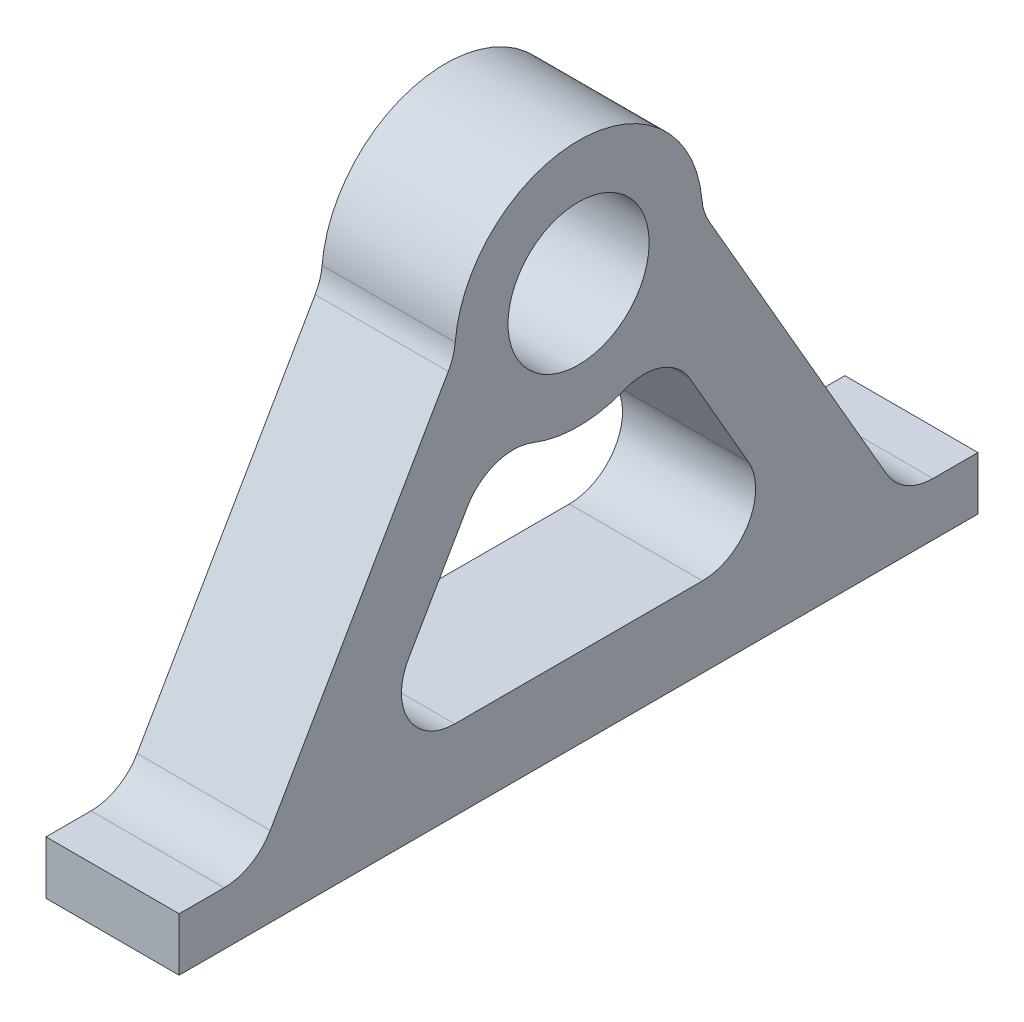
ISO-10303-21;
HEADER;
FILE_DESCRIPTION(('STEP AP214'),'2;1');
FILE_NAME('part.step','',(''),(''),'','','');
FILE_SCHEMA(('AUTOMOTIVE_DESIGN { 1 0 10303 214 1 1 1 1 }'));
ENDSEC;
DATA;
#1=APPLICATION_CONTEXT('core data for automotive mechanical design processes');
#2=APPLICATION_PROTOCOL_DEFINITION('international standard','automotive_design',2000,#1);
#3=PRODUCT_CONTEXT('',#1,'mechanical');
#4=PRODUCT('Part','Part','',(#3));
#5=PRODUCT_RELATED_PRODUCT_CATEGORY('part','',(#4));
#6=PRODUCT_DEFINITION_FORMATION('','',#4);
#7=PRODUCT_DEFINITION_CONTEXT('part definition',#1,'design');
#8=PRODUCT_DEFINITION('design','',#6,#7);
#9=PRODUCT_DEFINITION_SHAPE('','',#8);
#10=(LENGTH_UNIT() NAMED_UNIT(*) SI_UNIT(.MILLI.,.METRE.));
#11=(NAMED_UNIT(*) PLANE_ANGLE_UNIT() SI_UNIT($,.RADIAN.));
#12=(NAMED_UNIT(*) SI_UNIT($,.STERADIAN.) SOLID_ANGLE_UNIT());
#13=UNCERTAINTY_MEASURE_WITH_UNIT(LENGTH_MEASURE(1.E-05),#10,'distance_accuracy_value','');
#14=(GEOMETRIC_REPRESENTATION_CONTEXT(3) GLOBAL_UNCERTAINTY_ASSIGNED_CONTEXT((#13)) GLOBAL_UNIT_ASSIGNED_CONTEXT((#10,
#11,#12)) REPRESENTATION_CONTEXT('',''));
#15=CARTESIAN_POINT('',(0.,0.,0.));
#16=DIRECTION('',(0.,0.,1.));
#17=DIRECTION('',(1.,0.,0.));
#18=AXIS2_PLACEMENT_3D('',#15,#16,#17);
#19=CARTESIAN_POINT('',(2.5,0.,0.));
#20=DIRECTION('',(1.,0.,0.));
#21=DIRECTION('',(0.,0.,-1.));
#22=AXIS2_PLACEMENT_3D('',#19,#20,#21);
#23=PLANE('',#22);
#24=DIRECTION('',(0.,0.866025403784442,0.499999999999995));
#25=VECTOR('',#24,1.);
#26=CARTESIAN_POINT('',(2.5,0.,-4.65));
#27=LINE('',#26,#25);
#28=CARTESIAN_POINT('',(2.5,-12.,-11.5782032302754));
#29=VERTEX_POINT('',#28);
#30=CARTESIAN_POINT('',(2.5,-0.420246134902778,-4.89262921911202));
#31=VERTEX_POINT('',#30);
#32=EDGE_CURVE('E219',#29,#31,#27,.T.);
#33=ORIENTED_EDGE('',*,*,#32,.T.);
#34=CARTESIAN_POINT('',(2.5,0.579753865097213,-6.6246800266809));
#35=DIRECTION('',(1.,0.,0.));
#36=DIRECTION('',(0.,0.,-1.));
#37=AXIS2_PLACEMENT_3D('',#34,#35,#36);
#38=CIRCLE('',#37,2.);
#39=CARTESIAN_POINT('',(2.5,0.405391800406322,-4.63229505625055));
#40=VERTEX_POINT('',#39);
#41=EDGE_CURVE('E62',#31,#40,#38,.F.);
#42=ORIENTED_EDGE('',*,*,#41,.T.);
#43=CARTESIAN_POINT('',(2.5,0.,0.));
#44=DIRECTION('',(1.,0.,0.));
#45=DIRECTION('',(0.,0.,-1.));
#46=AXIS2_PLACEMENT_3D('',#43,#44,#45);
#47=CIRCLE('',#46,4.65);
#48=CARTESIAN_POINT('',(2.5,0.405391800406322,4.63229505625055));
#49=VERTEX_POINT('',#48);
#50=EDGE_CURVE('E250',#40,#49,#47,.T.);
#51=ORIENTED_EDGE('',*,*,#50,.T.);
#52=CARTESIAN_POINT('',(2.5,0.579753865097213,6.6246800266809));
#53=DIRECTION('',(1.,0.,0.));
#54=DIRECTION('',(0.,0.,-1.));
#55=AXIS2_PLACEMENT_3D('',#52,#53,#54);
#56=CIRCLE('',#55,2.);
#57=CARTESIAN_POINT('',(2.5,-0.420246134902778,4.89262921911202));
#58=VERTEX_POINT('',#57);
#59=EDGE_CURVE('E11',#49,#58,#56,.F.);
#60=ORIENTED_EDGE('',*,*,#59,.T.);
#61=DIRECTION('',(0.,-0.866025403784442,0.499999999999995));
#62=VECTOR('',#61,1.);
#63=CARTESIAN_POINT('',(2.5,0.,4.65));
#64=LINE('',#63,#62);
#65=CARTESIAN_POINT('',(2.5,-12.,11.5782032302754));
#66=VERTEX_POINT('',#65);
#67=EDGE_CURVE('E189',#58,#66,#64,.T.);
#68=ORIENTED_EDGE('',*,*,#67,.T.);
#69=CARTESIAN_POINT('',(2.5,-11.,13.3102540378443));
#70=DIRECTION('',(1.,0.,0.));
#71=DIRECTION('',(0.,0.,-1.));
#72=AXIS2_PLACEMENT_3D('',#69,#70,#71);
#73=CIRCLE('',#72,2.);
#74=CARTESIAN_POINT('',(2.5,-13.,13.3102540378443));
#75=VERTEX_POINT('',#74);
#76=EDGE_CURVE('E184',#66,#75,#73,.F.);
#77=ORIENTED_EDGE('',*,*,#76,.T.);
#78=DIRECTION('',(0.,0.,1.));
#79=VECTOR('',#78,1.);
#80=CARTESIAN_POINT('',(2.5,-13.,12.155553499465));
#81=LINE('',#80,#79);
#82=CARTESIAN_POINT('',(2.5,-13.,15.));
#83=VERTEX_POINT('',#82);
#84=EDGE_CURVE('E176',#75,#83,#81,.T.);
#85=ORIENTED_EDGE('',*,*,#84,.T.);
#86=DIRECTION('',(0.,-1.,0.));
#87=VECTOR('',#86,1.);
#88=CARTESIAN_POINT('',(2.5,-13.,15.));
#89=LINE('',#88,#87);
#90=CARTESIAN_POINT('',(2.5,-15.,15.));
#91=VERTEX_POINT('',#90);
#92=EDGE_CURVE('E180',#83,#91,#89,.T.);
#93=ORIENTED_EDGE('',*,*,#92,.T.);
#94=DIRECTION('',(0.,0.,-1.));
#95=VECTOR('',#94,1.);
#96=CARTESIAN_POINT('',(2.5,-15.,15.));
#97=LINE('',#96,#95);
#98=CARTESIAN_POINT('',(2.5,-15.,-15.));
#99=VERTEX_POINT('',#98);
#100=EDGE_CURVE('E206',#91,#99,#97,.T.);
#101=ORIENTED_EDGE('',*,*,#100,.T.);
#102=DIRECTION('',(0.,1.,0.));
#103=VECTOR('',#102,1.);
#104=CARTESIAN_POINT('',(2.5,-13.,-15.));
#105=LINE('',#104,#103);
#106=CARTESIAN_POINT('',(2.5,-13.,-15.));
#107=VERTEX_POINT('',#106);
#108=EDGE_CURVE('E209',#99,#107,#105,.T.);
#109=ORIENTED_EDGE('',*,*,#108,.T.);
#110=DIRECTION('',(0.,0.,1.));
#111=VECTOR('',#110,1.);
#112=CARTESIAN_POINT('',(2.5,-13.,-12.155553499465));
#113=LINE('',#112,#111);
#114=CARTESIAN_POINT('',(2.5,-13.,-13.3102540378443));
#115=VERTEX_POINT('',#114);
#116=EDGE_CURVE('E215',#107,#115,#113,.T.);
#117=ORIENTED_EDGE('',*,*,#116,.T.);
#118=CARTESIAN_POINT('',(2.5,-11.,-13.3102540378443));
#119=DIRECTION('',(1.,0.,0.));
#120=DIRECTION('',(0.,0.,-1.));
#121=AXIS2_PLACEMENT_3D('',#118,#119,#120);
#122=CIRCLE('',#121,2.);
#123=EDGE_CURVE('E316',#115,#29,#122,.F.);
#124=ORIENTED_EDGE('',*,*,#123,.T.);
#125=EDGE_LOOP('',(#33,#42,#51,#60,#68,#77,#85,#93,#101,#109,#117,#124));
#126=FACE_BOUND('',#125,.T.);
#127=CARTESIAN_POINT('',(2.5,0.,0.));
#128=DIRECTION('',(1.,0.,0.));
#129=DIRECTION('',(0.,0.,-1.));
#130=AXIS2_PLACEMENT_3D('',#127,#128,#129);
#131=CIRCLE('',#130,2.65);
#132=CARTESIAN_POINT('',(2.5,0.,-2.65));
#133=VERTEX_POINT('',#132);
#134=EDGE_CURVE('E227',#133,#133,#131,.T.);
#135=ORIENTED_EDGE('',*,*,#134,.F.);
#136=EDGE_LOOP('',(#135));
#137=FACE_BOUND('',#136,.T.);
#138=DIRECTION('',(0.,0.,-1.));
#139=VECTOR('',#138,1.);
#140=CARTESIAN_POINT('',(2.5,-12.,8.11410161513767));
#141=LINE('',#140,#139);
#142=CARTESIAN_POINT('',(2.5,-12.,4.64999999999994));
#143=VERTEX_POINT('',#142);
#144=CARTESIAN_POINT('',(2.5,-12.,-4.64999999999994));
#145=VERTEX_POINT('',#144);
#146=EDGE_CURVE('E403',#143,#145,#141,.T.);
#147=ORIENTED_EDGE('',*,*,#146,.F.);
#148=CARTESIAN_POINT('',(2.5,-10.,4.64999999999994));
#149=DIRECTION('',(1.,0.,0.));
#150=DIRECTION('',(0.,0.,-1.));
#151=AXIS2_PLACEMENT_3D('',#148,#149,#150);
#152=CIRCLE('',#151,2.);
#153=CARTESIAN_POINT('',(2.5,-9.00000000000001,6.38205080756882));
#154=VERTEX_POINT('',#153);
#155=EDGE_CURVE('E333',#143,#154,#152,.F.);
#156=ORIENTED_EDGE('',*,*,#155,.T.);
#157=DIRECTION('',(0.,-0.866025403784442,0.499999999999995));
#158=VECTOR('',#157,1.);
#159=CARTESIAN_POINT('',(2.5,-3.41406020028672,3.15700696052736));
#160=LINE('',#159,#158);
#161=CARTESIAN_POINT('',(2.5,-5.1835827124483,4.17864125926093));
#162=VERTEX_POINT('',#161);
#163=EDGE_CURVE('E383',#162,#154,#160,.T.);
#164=ORIENTED_EDGE('',*,*,#163,.F.);
#165=CARTESIAN_POINT('',(2.5,-6.18358271244829,2.44659045169205));
#166=DIRECTION('',(1.,0.,0.));
#167=DIRECTION('',(0.,0.,-1.));
#168=AXIS2_PLACEMENT_3D('',#165,#166,#167);
#169=CIRCLE('',#168,2.);
#170=CARTESIAN_POINT('',(2.5,-4.32385858840369,1.71077377449143));
#171=VERTEX_POINT('',#170);
#172=EDGE_CURVE('E339',#162,#171,#169,.F.);
#173=ORIENTED_EDGE('',*,*,#172,.T.);
#174=CARTESIAN_POINT('',(2.5,0.,0.));
#175=DIRECTION('',(-1.,0.,0.));
#176=DIRECTION('',(0.,0.,-1.));
#177=AXIS2_PLACEMENT_3D('',#174,#175,#176);
#178=CIRCLE('',#177,4.65);
#179=CARTESIAN_POINT('',(2.5,-4.32385858840369,-1.71077377449143));
#180=VERTEX_POINT('',#179);
#181=EDGE_CURVE('E375',#180,#171,#178,.T.);
#182=ORIENTED_EDGE('',*,*,#181,.F.);
#183=CARTESIAN_POINT('',(2.5,-6.18358271244829,-2.44659045169205));
#184=DIRECTION('',(1.,0.,0.));
#185=DIRECTION('',(0.,0.,-1.));
#186=AXIS2_PLACEMENT_3D('',#183,#184,#185);
#187=CIRCLE('',#186,2.);
#188=CARTESIAN_POINT('',(2.5,-5.1835827124483,-4.17864125926093));
#189=VERTEX_POINT('',#188);
#190=EDGE_CURVE('E345',#180,#189,#187,.F.);
#191=ORIENTED_EDGE('',*,*,#190,.T.);
#192=DIRECTION('',(0.,0.866025403784442,0.499999999999995));
#193=VECTOR('',#192,1.);
#194=CARTESIAN_POINT('',(2.5,-3.41406020028672,-3.15700696052736));
#195=LINE('',#194,#193);
#196=CARTESIAN_POINT('',(2.5,-9.00000000000001,-6.38205080756882));
#197=VERTEX_POINT('',#196);
#198=EDGE_CURVE('E399',#197,#189,#195,.T.);
#199=ORIENTED_EDGE('',*,*,#198,.F.);
#200=CARTESIAN_POINT('',(2.5,-10.,-4.64999999999994));
#201=DIRECTION('',(1.,0.,0.));
#202=DIRECTION('',(0.,0.,-1.));
#203=AXIS2_PLACEMENT_3D('',#200,#201,#202);
#204=CIRCLE('',#203,2.);
#205=EDGE_CURVE('E327',#197,#145,#204,.F.);
#206=ORIENTED_EDGE('',*,*,#205,.T.);
#207=EDGE_LOOP('',(#147,#156,#164,#173,#182,#191,#199,#206));
#208=FACE_BOUND('',#207,.T.);
#209=ADVANCED_FACE('F39',(#126,#137,#208),#23,.T.);
#210=CARTESIAN_POINT('',(-2.5,0.,0.));
#211=DIRECTION('',(1.,0.,0.));
#212=DIRECTION('',(0.,0.,-1.));
#213=AXIS2_PLACEMENT_3D('',#210,#211,#212);
#214=PLANE('',#213);
#215=CARTESIAN_POINT('',(-2.5,0.,0.));
#216=DIRECTION('',(1.,0.,0.));
#217=DIRECTION('',(0.,0.,-1.));
#218=AXIS2_PLACEMENT_3D('',#215,#216,#217);
#219=CIRCLE('',#218,2.65);
#220=CARTESIAN_POINT('',(-2.5,0.,-2.65));
#221=VERTEX_POINT('',#220);
#222=EDGE_CURVE('E371',#221,#221,#219,.T.);
#223=ORIENTED_EDGE('',*,*,#222,.T.);
#224=EDGE_LOOP('',(#223));
#225=FACE_BOUND('',#224,.T.);
#226=CARTESIAN_POINT('',(-2.5,0.,0.));
#227=DIRECTION('',(1.,0.,0.));
#228=DIRECTION('',(0.,0.,-1.));
#229=AXIS2_PLACEMENT_3D('',#226,#227,#228);
#230=CIRCLE('',#229,4.65);
#231=CARTESIAN_POINT('',(-2.5,0.405391800406322,-4.63229505625055));
#232=VERTEX_POINT('',#231);
#233=CARTESIAN_POINT('',(-2.5,0.405391800406322,4.63229505625055));
#234=VERTEX_POINT('',#233);
#235=EDGE_CURVE('E223',#232,#234,#230,.T.);
#236=ORIENTED_EDGE('',*,*,#235,.F.);
#237=CARTESIAN_POINT('',(-2.5,0.579753865097213,-6.6246800266809));
#238=DIRECTION('',(1.,0.,0.));
#239=DIRECTION('',(0.,0.,-1.));
#240=AXIS2_PLACEMENT_3D('',#237,#238,#239);
#241=CIRCLE('',#240,2.);
#242=CARTESIAN_POINT('',(-2.5,-0.420246134902778,-4.89262921911202));
#243=VERTEX_POINT('',#242);
#244=EDGE_CURVE('E348',#232,#243,#241,.T.);
#245=ORIENTED_EDGE('',*,*,#244,.T.);
#246=DIRECTION('',(0.,0.866025403784442,0.499999999999995));
#247=VECTOR('',#246,1.);
#248=CARTESIAN_POINT('',(-2.5,0.,-4.65));
#249=LINE('',#248,#247);
#250=CARTESIAN_POINT('',(-2.5,-12.,-11.5782032302754));
#251=VERTEX_POINT('',#250);
#252=EDGE_CURVE('E246',#251,#243,#249,.T.);
#253=ORIENTED_EDGE('',*,*,#252,.F.);
#254=CARTESIAN_POINT('',(-2.5,-11.,-13.3102540378443));
#255=DIRECTION('',(1.,0.,0.));
#256=DIRECTION('',(0.,0.,-1.));
#257=AXIS2_PLACEMENT_3D('',#254,#255,#256);
#258=CIRCLE('',#257,2.);
#259=CARTESIAN_POINT('',(-2.5,-13.,-13.3102540378443));
#260=VERTEX_POINT('',#259);
#261=EDGE_CURVE('E313',#251,#260,#258,.T.);
#262=ORIENTED_EDGE('',*,*,#261,.T.);
#263=DIRECTION('',(0.,0.,1.));
#264=VECTOR('',#263,1.);
#265=CARTESIAN_POINT('',(-2.5,-13.,-12.155553499465));
#266=LINE('',#265,#264);
#267=CARTESIAN_POINT('',(-2.5,-13.,-15.));
#268=VERTEX_POINT('',#267);
#269=EDGE_CURVE('E242',#268,#260,#266,.T.);
#270=ORIENTED_EDGE('',*,*,#269,.F.);
#271=DIRECTION('',(0.,1.,0.));
#272=VECTOR('',#271,1.);
#273=CARTESIAN_POINT('',(-2.5,-13.,-15.));
#274=LINE('',#273,#272);
#275=CARTESIAN_POINT('',(-2.5,-15.,-15.));
#276=VERTEX_POINT('',#275);
#277=EDGE_CURVE('E239',#276,#268,#274,.T.);
#278=ORIENTED_EDGE('',*,*,#277,.F.);
#279=DIRECTION('',(0.,0.,-1.));
#280=VECTOR('',#279,1.);
#281=CARTESIAN_POINT('',(-2.5,-15.,15.));
#282=LINE('',#281,#280);
#283=CARTESIAN_POINT('',(-2.5,-15.,15.));
#284=VERTEX_POINT('',#283);
#285=EDGE_CURVE('E236',#284,#276,#282,.T.);
#286=ORIENTED_EDGE('',*,*,#285,.F.);
#287=DIRECTION('',(0.,-1.,0.));
#288=VECTOR('',#287,1.);
#289=CARTESIAN_POINT('',(-2.5,-13.,15.));
#290=LINE('',#289,#288);
#291=CARTESIAN_POINT('',(-2.5,-13.,15.));
#292=VERTEX_POINT('',#291);
#293=EDGE_CURVE('E233',#292,#284,#290,.T.);
#294=ORIENTED_EDGE('',*,*,#293,.F.);
#295=DIRECTION('',(0.,0.,1.));
#296=VECTOR('',#295,1.);
#297=CARTESIAN_POINT('',(-2.5,-13.,12.155553499465));
#298=LINE('',#297,#296);
#299=CARTESIAN_POINT('',(-2.5,-13.,13.3102540378443));
#300=VERTEX_POINT('',#299);
#301=EDGE_CURVE('E195',#300,#292,#298,.T.);
#302=ORIENTED_EDGE('',*,*,#301,.F.);
#303=CARTESIAN_POINT('',(-2.5,-11.,13.3102540378443));
#304=DIRECTION('',(1.,0.,0.));
#305=DIRECTION('',(0.,0.,-1.));
#306=AXIS2_PLACEMENT_3D('',#303,#304,#305);
#307=CIRCLE('',#306,2.);
#308=CARTESIAN_POINT('',(-2.5,-12.,11.5782032302754));
#309=VERTEX_POINT('',#308);
#310=EDGE_CURVE('E319',#300,#309,#307,.T.);
#311=ORIENTED_EDGE('',*,*,#310,.T.);
#312=DIRECTION('',(0.,-0.866025403784442,0.499999999999995));
#313=VECTOR('',#312,1.);
#314=CARTESIAN_POINT('',(-2.5,0.,4.65));
#315=LINE('',#314,#313);
#316=CARTESIAN_POINT('',(-2.5,-0.420246134902778,4.89262921911202));
#317=VERTEX_POINT('',#316);
#318=EDGE_CURVE('E226',#317,#309,#315,.T.);
#319=ORIENTED_EDGE('',*,*,#318,.F.);
#320=CARTESIAN_POINT('',(-2.5,0.579753865097213,6.6246800266809));
#321=DIRECTION('',(1.,0.,0.));
#322=DIRECTION('',(0.,0.,-1.));
#323=AXIS2_PLACEMENT_3D('',#320,#321,#322);
#324=CIRCLE('',#323,2.);
#325=EDGE_CURVE('E48',#317,#234,#324,.T.);
#326=ORIENTED_EDGE('',*,*,#325,.T.);
#327=EDGE_LOOP('',(#236,#245,#253,#262,#270,#278,#286,#294,#302,#311,#319,#326));
#328=FACE_BOUND('',#327,.T.);
#329=CARTESIAN_POINT('',(-2.5,0.,0.));
#330=DIRECTION('',(-1.,0.,0.));
#331=DIRECTION('',(0.,0.,-1.));
#332=AXIS2_PLACEMENT_3D('',#329,#330,#331);
#333=CIRCLE('',#332,4.65);
#334=CARTESIAN_POINT('',(-2.5,-4.32385858840369,-1.71077377449143));
#335=VERTEX_POINT('',#334);
#336=CARTESIAN_POINT('',(-2.5,-4.32385858840369,1.71077377449143));
#337=VERTEX_POINT('',#336);
#338=EDGE_CURVE('E379',#335,#337,#333,.T.);
#339=ORIENTED_EDGE('',*,*,#338,.T.);
#340=CARTESIAN_POINT('',(-2.5,-6.18358271244829,2.44659045169205));
#341=DIRECTION('',(1.,0.,0.));
#342=DIRECTION('',(0.,0.,-1.));
#343=AXIS2_PLACEMENT_3D('',#340,#341,#342);
#344=CIRCLE('',#343,2.);
#345=CARTESIAN_POINT('',(-2.5,-5.1835827124483,4.17864125926093));
#346=VERTEX_POINT('',#345);
#347=EDGE_CURVE('E336',#337,#346,#344,.T.);
#348=ORIENTED_EDGE('',*,*,#347,.T.);
#349=DIRECTION('',(0.,-0.866025403784442,0.499999999999995));
#350=VECTOR('',#349,1.);
#351=CARTESIAN_POINT('',(-2.5,-3.41406020028672,3.15700696052736));
#352=LINE('',#351,#350);
#353=CARTESIAN_POINT('',(-2.5,-9.00000000000001,6.38205080756882));
#354=VERTEX_POINT('',#353);
#355=EDGE_CURVE('E392',#346,#354,#352,.T.);
#356=ORIENTED_EDGE('',*,*,#355,.T.);
#357=CARTESIAN_POINT('',(-2.5,-10.,4.64999999999994));
#358=DIRECTION('',(1.,0.,0.));
#359=DIRECTION('',(0.,0.,-1.));
#360=AXIS2_PLACEMENT_3D('',#357,#358,#359);
#361=CIRCLE('',#360,2.);
#362=CARTESIAN_POINT('',(-2.5,-12.,4.64999999999994));
#363=VERTEX_POINT('',#362);
#364=EDGE_CURVE('E330',#354,#363,#361,.T.);
#365=ORIENTED_EDGE('',*,*,#364,.T.);
#366=DIRECTION('',(0.,0.,-1.));
#367=VECTOR('',#366,1.);
#368=CARTESIAN_POINT('',(-2.5,-12.,8.11410161513767));
#369=LINE('',#368,#367);
#370=CARTESIAN_POINT('',(-2.5,-12.,-4.64999999999994));
#371=VERTEX_POINT('',#370);
#372=EDGE_CURVE('E388',#363,#371,#369,.T.);
#373=ORIENTED_EDGE('',*,*,#372,.T.);
#374=CARTESIAN_POINT('',(-2.5,-10.,-4.64999999999994));
#375=DIRECTION('',(1.,0.,0.));
#376=DIRECTION('',(0.,0.,-1.));
#377=AXIS2_PLACEMENT_3D('',#374,#375,#376);
#378=CIRCLE('',#377,2.);
#379=CARTESIAN_POINT('',(-2.5,-9.00000000000001,-6.38205080756882));
#380=VERTEX_POINT('',#379);
#381=EDGE_CURVE('E324',#371,#380,#378,.T.);
#382=ORIENTED_EDGE('',*,*,#381,.T.);
#383=DIRECTION('',(0.,0.866025403784442,0.499999999999995));
#384=VECTOR('',#383,1.);
#385=CARTESIAN_POINT('',(-2.5,-3.41406020028672,-3.15700696052736));
#386=LINE('',#385,#384);
#387=CARTESIAN_POINT('',(-2.5,-5.1835827124483,-4.17864125926093));
#388=VERTEX_POINT('',#387);
#389=EDGE_CURVE('E384',#380,#388,#386,.T.);
#390=ORIENTED_EDGE('',*,*,#389,.T.);
#391=CARTESIAN_POINT('',(-2.5,-6.18358271244829,-2.44659045169205));
#392=DIRECTION('',(1.,0.,0.));
#393=DIRECTION('',(0.,0.,-1.));
#394=AXIS2_PLACEMENT_3D('',#391,#392,#393);
#395=CIRCLE('',#394,2.);
#396=EDGE_CURVE('E342',#388,#335,#395,.T.);
#397=ORIENTED_EDGE('',*,*,#396,.T.);
#398=EDGE_LOOP('',(#339,#348,#356,#365,#373,#382,#390,#397));
#399=FACE_BOUND('',#398,.T.);
#400=ADVANCED_FACE('F356',(#225,#328,#399),#214,.F.);
#401=CARTESIAN_POINT('',(2.5,0.,0.));
#402=DIRECTION('',(-1.,0.,0.));
#403=DIRECTION('',(0.,0.,1.));
#404=AXIS2_PLACEMENT_3D('',#401,#402,#403);
#405=CYLINDRICAL_SURFACE('',#404,4.65);
#406=ORIENTED_EDGE('',*,*,#50,.F.);
#407=DIRECTION('',(-1.,0.,0.));
#408=VECTOR('',#407,1.);
#409=CARTESIAN_POINT('',(2.5,0.405391800406322,-4.63229505625055));
#410=LINE('',#409,#408);
#411=EDGE_CURVE('E309',#40,#232,#410,.T.);
#412=ORIENTED_EDGE('',*,*,#411,.T.);
#413=ORIENTED_EDGE('',*,*,#235,.T.);
#414=DIRECTION('',(-1.,0.,0.));
#415=VECTOR('',#414,1.);
#416=CARTESIAN_POINT('',(2.5,0.405391800406322,4.63229505625055));
#417=LINE('',#416,#415);
#418=EDGE_CURVE('E55',#234,#49,#417,.F.);
#419=ORIENTED_EDGE('',*,*,#418,.T.);
#420=EDGE_LOOP('',(#406,#412,#413,#419));
#421=FACE_BOUND('',#420,.T.);
#422=ADVANCED_FACE('F360',(#421),#405,.T.);
#423=CARTESIAN_POINT('',(2.5,0.,4.65));
#424=DIRECTION('',(0.,-0.499999999999995,-0.866025403784442));
#425=DIRECTION('',(0.,0.866025403784442,-0.499999999999995));
#426=AXIS2_PLACEMENT_3D('',#423,#424,#425);
#427=PLANE('',#426);
#428=ORIENTED_EDGE('',*,*,#318,.T.);
#429=DIRECTION('',(-1.,0.,0.));
#430=VECTOR('',#429,1.);
#431=CARTESIAN_POINT('',(2.5,-12.,11.5782032302754));
#432=LINE('',#431,#430);
#433=EDGE_CURVE('E276',#309,#66,#432,.F.);
#434=ORIENTED_EDGE('',*,*,#433,.T.);
#435=ORIENTED_EDGE('',*,*,#67,.F.);
#436=DIRECTION('',(1.,0.,0.));
#437=VECTOR('',#436,1.);
#438=CARTESIAN_POINT('',(-2.5,-0.420246134902778,4.89262921911202));
#439=LINE('',#438,#437);
#440=EDGE_CURVE('E272',#58,#317,#439,.F.);
#441=ORIENTED_EDGE('',*,*,#440,.T.);
#442=EDGE_LOOP('',(#428,#434,#435,#441));
#443=FACE_BOUND('',#442,.T.);
#444=ADVANCED_FACE('F365',(#443),#427,.F.);
#445=CARTESIAN_POINT('',(2.5,-13.,12.155553499465));
#446=DIRECTION('',(0.,-1.,0.));
#447=DIRECTION('',(0.,0.,-1.));
#448=AXIS2_PLACEMENT_3D('',#445,#446,#447);
#449=PLANE('',#448);
#450=ORIENTED_EDGE('',*,*,#84,.F.);
#451=DIRECTION('',(-1.,0.,0.));
#452=VECTOR('',#451,1.);
#453=CARTESIAN_POINT('',(-2.5,-13.,13.3102540378443));
#454=LINE('',#453,#452);
#455=EDGE_CURVE('E269',#75,#300,#454,.T.);
#456=ORIENTED_EDGE('',*,*,#455,.T.);
#457=ORIENTED_EDGE('',*,*,#301,.T.);
#458=DIRECTION('',(-1.,0.,0.));
#459=VECTOR('',#458,1.);
#460=CARTESIAN_POINT('',(2.5,-13.,15.));
#461=LINE('',#460,#459);
#462=EDGE_CURVE('E192',#83,#292,#461,.T.);
#463=ORIENTED_EDGE('',*,*,#462,.F.);
#464=EDGE_LOOP('',(#450,#456,#457,#463));
#465=FACE_BOUND('',#464,.T.);
#466=ADVANCED_FACE('F193',(#465),#449,.F.);
#467=CARTESIAN_POINT('',(2.5,-13.,15.));
#468=DIRECTION('',(0.,0.,-1.));
#469=DIRECTION('',(-1.,0.,0.));
#470=AXIS2_PLACEMENT_3D('',#467,#468,#469);
#471=PLANE('',#470);
#472=ORIENTED_EDGE('',*,*,#293,.T.);
#473=DIRECTION('',(-1.,0.,0.));
#474=VECTOR('',#473,1.);
#475=CARTESIAN_POINT('',(2.5,-15.,15.));
#476=LINE('',#475,#474);
#477=EDGE_CURVE('E200',#91,#284,#476,.T.);
#478=ORIENTED_EDGE('',*,*,#477,.F.);
#479=ORIENTED_EDGE('',*,*,#92,.F.);
#480=ORIENTED_EDGE('',*,*,#462,.T.);
#481=EDGE_LOOP('',(#472,#478,#479,#480));
#482=FACE_BOUND('',#481,.T.);
#483=ADVANCED_FACE('F202',(#482),#471,.F.);
#484=CARTESIAN_POINT('',(2.5,-15.,15.));
#485=DIRECTION('',(0.,1.,0.));
#486=DIRECTION('',(0.,0.,1.));
#487=AXIS2_PLACEMENT_3D('',#484,#485,#486);
#488=PLANE('',#487);
#489=ORIENTED_EDGE('',*,*,#285,.T.);
#490=DIRECTION('',(-1.,0.,0.));
#491=VECTOR('',#490,1.);
#492=CARTESIAN_POINT('',(2.5,-15.,-15.));
#493=LINE('',#492,#491);
#494=EDGE_CURVE('E254',#99,#276,#493,.T.);
#495=ORIENTED_EDGE('',*,*,#494,.F.);
#496=ORIENTED_EDGE('',*,*,#100,.F.);
#497=ORIENTED_EDGE('',*,*,#477,.T.);
#498=EDGE_LOOP('',(#489,#495,#496,#497));
#499=FACE_BOUND('',#498,.T.);
#500=ADVANCED_FACE('F468',(#499),#488,.F.);
#501=CARTESIAN_POINT('',(2.5,-13.,-15.));
#502=DIRECTION('',(0.,0.,1.));
#503=DIRECTION('',(1.,0.,0.));
#504=AXIS2_PLACEMENT_3D('',#501,#502,#503);
#505=PLANE('',#504);
#506=ORIENTED_EDGE('',*,*,#277,.T.);
#507=DIRECTION('',(-1.,0.,0.));
#508=VECTOR('',#507,1.);
#509=CARTESIAN_POINT('',(2.5,-13.,-15.));
#510=LINE('',#509,#508);
#511=EDGE_CURVE('E222',#107,#268,#510,.T.);
#512=ORIENTED_EDGE('',*,*,#511,.F.);
#513=ORIENTED_EDGE('',*,*,#108,.F.);
#514=ORIENTED_EDGE('',*,*,#494,.T.);
#515=EDGE_LOOP('',(#506,#512,#513,#514));
#516=FACE_BOUND('',#515,.T.);
#517=ADVANCED_FACE('F464',(#516),#505,.F.);
#518=CARTESIAN_POINT('',(2.5,-13.,-12.155553499465));
#519=DIRECTION('',(0.,-1.,0.));
#520=DIRECTION('',(0.,0.,-1.));
#521=AXIS2_PLACEMENT_3D('',#518,#519,#520);
#522=PLANE('',#521);
#523=ORIENTED_EDGE('',*,*,#269,.T.);
#524=DIRECTION('',(-1.,0.,0.));
#525=VECTOR('',#524,1.);
#526=CARTESIAN_POINT('',(2.5,-13.,-13.3102540378443));
#527=LINE('',#526,#525);
#528=EDGE_CURVE('E266',#260,#115,#527,.F.);
#529=ORIENTED_EDGE('',*,*,#528,.T.);
#530=ORIENTED_EDGE('',*,*,#116,.F.);
#531=ORIENTED_EDGE('',*,*,#511,.T.);
#532=EDGE_LOOP('',(#523,#529,#530,#531));
#533=FACE_BOUND('',#532,.T.);
#534=ADVANCED_FACE('F460',(#533),#522,.F.);
#535=CARTESIAN_POINT('',(2.5,0.,-4.65));
#536=DIRECTION('',(0.,-0.499999999999995,0.866025403784442));
#537=DIRECTION('',(0.,-0.866025403784442,-0.499999999999995));
#538=AXIS2_PLACEMENT_3D('',#535,#536,#537);
#539=PLANE('',#538);
#540=ORIENTED_EDGE('',*,*,#32,.F.);
#541=DIRECTION('',(-1.,0.,0.));
#542=VECTOR('',#541,1.);
#543=CARTESIAN_POINT('',(-2.5,-12.,-11.5782032302754));
#544=LINE('',#543,#542);
#545=EDGE_CURVE('E262',#29,#251,#544,.T.);
#546=ORIENTED_EDGE('',*,*,#545,.T.);
#547=ORIENTED_EDGE('',*,*,#252,.T.);
#548=DIRECTION('',(1.,0.,0.));
#549=VECTOR('',#548,1.);
#550=CARTESIAN_POINT('',(2.5,-0.420246134902778,-4.89262921911202));
#551=LINE('',#550,#549);
#552=EDGE_CURVE('E199',#243,#31,#551,.T.);
#553=ORIENTED_EDGE('',*,*,#552,.T.);
#554=EDGE_LOOP('',(#540,#546,#547,#553));
#555=FACE_BOUND('',#554,.T.);
#556=ADVANCED_FACE('F457',(#555),#539,.F.);
#557=CARTESIAN_POINT('',(2.5,0.,0.));
#558=DIRECTION('',(-1.,0.,0.));
#559=DIRECTION('',(0.,0.,1.));
#560=AXIS2_PLACEMENT_3D('',#557,#558,#559);
#561=CYLINDRICAL_SURFACE('',#560,2.65);
#562=ORIENTED_EDGE('',*,*,#134,.T.);
#563=EDGE_LOOP('',(#562));
#564=FACE_BOUND('',#563,.T.);
#565=ORIENTED_EDGE('',*,*,#222,.F.);
#566=EDGE_LOOP('',(#565));
#567=FACE_BOUND('',#566,.T.);
#568=ADVANCED_FACE('F454',(#564,#567),#561,.F.);
#569=CARTESIAN_POINT('',(2.5,-3.41406020028672,3.15700696052736));
#570=DIRECTION('',(0.,-0.499999999999995,-0.866025403784442));
#571=DIRECTION('',(0.,0.866025403784442,-0.499999999999995));
#572=AXIS2_PLACEMENT_3D('',#569,#570,#571);
#573=PLANE('',#572);
#574=ORIENTED_EDGE('',*,*,#163,.T.);
#575=DIRECTION('',(-1.,0.,0.));
#576=VECTOR('',#575,1.);
#577=CARTESIAN_POINT('',(-2.5,-9.00000000000001,6.38205080756882));
#578=LINE('',#577,#576);
#579=EDGE_CURVE('E296',#154,#354,#578,.T.);
#580=ORIENTED_EDGE('',*,*,#579,.T.);
#581=ORIENTED_EDGE('',*,*,#355,.F.);
#582=DIRECTION('',(1.,0.,0.));
#583=VECTOR('',#582,1.);
#584=CARTESIAN_POINT('',(2.5,-5.1835827124483,4.17864125926093));
#585=LINE('',#584,#583);
#586=EDGE_CURVE('E293',#346,#162,#585,.T.);
#587=ORIENTED_EDGE('',*,*,#586,.T.);
#588=EDGE_LOOP('',(#574,#580,#581,#587));
#589=FACE_BOUND('',#588,.T.);
#590=ADVANCED_FACE('F412',(#589),#573,.T.);
#591=CARTESIAN_POINT('',(2.5,-12.,8.11410161513767));
#592=DIRECTION('',(0.,1.,0.));
#593=DIRECTION('',(0.,0.,1.));
#594=AXIS2_PLACEMENT_3D('',#591,#592,#593);
#595=PLANE('',#594);
#596=ORIENTED_EDGE('',*,*,#146,.T.);
#597=DIRECTION('',(-1.,0.,0.));
#598=VECTOR('',#597,1.);
#599=CARTESIAN_POINT('',(-2.5,-12.,-4.64999999999994));
#600=LINE('',#599,#598);
#601=EDGE_CURVE('E282',#145,#371,#600,.T.);
#602=ORIENTED_EDGE('',*,*,#601,.T.);
#603=ORIENTED_EDGE('',*,*,#372,.F.);
#604=DIRECTION('',(-1.,0.,0.));
#605=VECTOR('',#604,1.);
#606=CARTESIAN_POINT('',(2.5,-12.,4.64999999999994));
#607=LINE('',#606,#605);
#608=EDGE_CURVE('E279',#363,#143,#607,.F.);
#609=ORIENTED_EDGE('',*,*,#608,.T.);
#610=EDGE_LOOP('',(#596,#602,#603,#609));
#611=FACE_BOUND('',#610,.T.);
#612=ADVANCED_FACE('F423',(#611),#595,.T.);
#613=CARTESIAN_POINT('',(2.5,-3.41406020028672,-3.15700696052736));
#614=DIRECTION('',(0.,-0.499999999999995,0.866025403784442));
#615=DIRECTION('',(0.,-0.866025403784442,-0.499999999999995));
#616=AXIS2_PLACEMENT_3D('',#613,#614,#615);
#617=PLANE('',#616);
#618=ORIENTED_EDGE('',*,*,#389,.F.);
#619=DIRECTION('',(-1.,0.,0.));
#620=VECTOR('',#619,1.);
#621=CARTESIAN_POINT('',(2.5,-9.00000000000001,-6.38205080756882));
#622=LINE('',#621,#620);
#623=EDGE_CURVE('E290',#380,#197,#622,.F.);
#624=ORIENTED_EDGE('',*,*,#623,.T.);
#625=ORIENTED_EDGE('',*,*,#198,.T.);
#626=DIRECTION('',(1.,0.,0.));
#627=VECTOR('',#626,1.);
#628=CARTESIAN_POINT('',(-2.5,-5.1835827124483,-4.17864125926093));
#629=LINE('',#628,#627);
#630=EDGE_CURVE('E286',#189,#388,#629,.F.);
#631=ORIENTED_EDGE('',*,*,#630,.T.);
#632=EDGE_LOOP('',(#618,#624,#625,#631));
#633=FACE_BOUND('',#632,.T.);
#634=ADVANCED_FACE('F432',(#633),#617,.T.);
#635=CARTESIAN_POINT('',(2.5,0.,0.));
#636=DIRECTION('',(-1.,0.,0.));
#637=DIRECTION('',(0.,0.,1.));
#638=AXIS2_PLACEMENT_3D('',#635,#636,#637);
#639=CYLINDRICAL_SURFACE('',#638,4.65);
#640=ORIENTED_EDGE('',*,*,#181,.T.);
#641=DIRECTION('',(-1.,0.,0.));
#642=VECTOR('',#641,1.);
#643=CARTESIAN_POINT('',(2.5,-4.32385858840369,1.71077377449143));
#644=LINE('',#643,#642);
#645=EDGE_CURVE('E303',#171,#337,#644,.T.);
#646=ORIENTED_EDGE('',*,*,#645,.T.);
#647=ORIENTED_EDGE('',*,*,#338,.F.);
#648=DIRECTION('',(-1.,0.,0.));
#649=VECTOR('',#648,1.);
#650=CARTESIAN_POINT('',(2.5,-4.32385858840369,-1.71077377449143));
#651=LINE('',#650,#649);
#652=EDGE_CURVE('E300',#335,#180,#651,.F.);
#653=ORIENTED_EDGE('',*,*,#652,.T.);
#654=EDGE_LOOP('',(#640,#646,#647,#653));
#655=FACE_BOUND('',#654,.T.);
#656=ADVANCED_FACE('F441',(#655),#639,.T.);
#657=CARTESIAN_POINT('',(2.5,-11.,-13.3102540378443));
#658=DIRECTION('',(1.,0.,0.));
#659=DIRECTION('',(0.,0.,-1.));
#660=AXIS2_PLACEMENT_3D('',#657,#658,#659);
#661=CYLINDRICAL_SURFACE('',#660,2.);
#662=ORIENTED_EDGE('',*,*,#123,.F.);
#663=ORIENTED_EDGE('',*,*,#528,.F.);
#664=ORIENTED_EDGE('',*,*,#261,.F.);
#665=ORIENTED_EDGE('',*,*,#545,.F.);
#666=EDGE_LOOP('',(#662,#663,#664,#665));
#667=FACE_BOUND('',#666,.T.);
#668=ADVANCED_FACE('F481',(#667),#661,.F.);
#669=CARTESIAN_POINT('',(2.5,-11.,13.3102540378443));
#670=DIRECTION('',(1.,0.,0.));
#671=DIRECTION('',(0.,0.,-1.));
#672=AXIS2_PLACEMENT_3D('',#669,#670,#671);
#673=CYLINDRICAL_SURFACE('',#672,2.);
#674=ORIENTED_EDGE('',*,*,#76,.F.);
#675=ORIENTED_EDGE('',*,*,#433,.F.);
#676=ORIENTED_EDGE('',*,*,#310,.F.);
#677=ORIENTED_EDGE('',*,*,#455,.F.);
#678=EDGE_LOOP('',(#674,#675,#676,#677));
#679=FACE_BOUND('',#678,.T.);
#680=ADVANCED_FACE('F484',(#679),#673,.F.);
#681=CARTESIAN_POINT('',(2.5,-10.,-4.64999999999994));
#682=DIRECTION('',(1.,0.,0.));
#683=DIRECTION('',(0.,0.,-1.));
#684=AXIS2_PLACEMENT_3D('',#681,#682,#683);
#685=CYLINDRICAL_SURFACE('',#684,2.);
#686=ORIENTED_EDGE('',*,*,#205,.F.);
#687=ORIENTED_EDGE('',*,*,#623,.F.);
#688=ORIENTED_EDGE('',*,*,#381,.F.);
#689=ORIENTED_EDGE('',*,*,#601,.F.);
#690=EDGE_LOOP('',(#686,#687,#688,#689));
#691=FACE_BOUND('',#690,.T.);
#692=ADVANCED_FACE('F428',(#691),#685,.F.);
#693=CARTESIAN_POINT('',(2.5,-10.,4.64999999999994));
#694=DIRECTION('',(1.,0.,0.));
#695=DIRECTION('',(0.,0.,-1.));
#696=AXIS2_PLACEMENT_3D('',#693,#694,#695);
#697=CYLINDRICAL_SURFACE('',#696,2.);
#698=ORIENTED_EDGE('',*,*,#155,.F.);
#699=ORIENTED_EDGE('',*,*,#608,.F.);
#700=ORIENTED_EDGE('',*,*,#364,.F.);
#701=ORIENTED_EDGE('',*,*,#579,.F.);
#702=EDGE_LOOP('',(#698,#699,#700,#701));
#703=FACE_BOUND('',#702,.T.);
#704=ADVANCED_FACE('F419',(#703),#697,.F.);
#705=CARTESIAN_POINT('',(2.5,-6.18358271244829,2.44659045169205));
#706=DIRECTION('',(-1.,0.,0.));
#707=DIRECTION('',(0.,0.,1.));
#708=AXIS2_PLACEMENT_3D('',#705,#706,#707);
#709=CYLINDRICAL_SURFACE('',#708,2.);
#710=ORIENTED_EDGE('',*,*,#172,.F.);
#711=ORIENTED_EDGE('',*,*,#586,.F.);
#712=ORIENTED_EDGE('',*,*,#347,.F.);
#713=ORIENTED_EDGE('',*,*,#645,.F.);
#714=EDGE_LOOP('',(#710,#711,#712,#713));
#715=FACE_BOUND('',#714,.T.);
#716=ADVANCED_FACE('F445',(#715),#709,.F.);
#717=CARTESIAN_POINT('',(2.5,-6.18358271244829,-2.44659045169205));
#718=DIRECTION('',(-1.,0.,0.));
#719=DIRECTION('',(0.,0.,1.));
#720=AXIS2_PLACEMENT_3D('',#717,#718,#719);
#721=CYLINDRICAL_SURFACE('',#720,2.);
#722=ORIENTED_EDGE('',*,*,#190,.F.);
#723=ORIENTED_EDGE('',*,*,#652,.F.);
#724=ORIENTED_EDGE('',*,*,#396,.F.);
#725=ORIENTED_EDGE('',*,*,#630,.F.);
#726=EDGE_LOOP('',(#722,#723,#724,#725));
#727=FACE_BOUND('',#726,.T.);
#728=ADVANCED_FACE('F437',(#727),#721,.F.);
#729=CARTESIAN_POINT('',(2.5,0.579753865097213,-6.6246800266809));
#730=DIRECTION('',(-1.,0.,0.));
#731=DIRECTION('',(0.,0.,1.));
#732=AXIS2_PLACEMENT_3D('',#729,#730,#731);
#733=CYLINDRICAL_SURFACE('',#732,2.);
#734=ORIENTED_EDGE('',*,*,#41,.F.);
#735=ORIENTED_EDGE('',*,*,#552,.F.);
#736=ORIENTED_EDGE('',*,*,#244,.F.);
#737=ORIENTED_EDGE('',*,*,#411,.F.);
#738=EDGE_LOOP('',(#734,#735,#736,#737));
#739=FACE_BOUND('',#738,.T.);
#740=ADVANCED_FACE('F496',(#739),#733,.F.);
#741=CARTESIAN_POINT('',(2.5,0.579753865097213,6.6246800266809));
#742=DIRECTION('',(-1.,0.,0.));
#743=DIRECTION('',(0.,0.,1.));
#744=AXIS2_PLACEMENT_3D('',#741,#742,#743);
#745=CYLINDRICAL_SURFACE('',#744,2.);
#746=ORIENTED_EDGE('',*,*,#59,.F.);
#747=ORIENTED_EDGE('',*,*,#418,.F.);
#748=ORIENTED_EDGE('',*,*,#325,.F.);
#749=ORIENTED_EDGE('',*,*,#440,.F.);
#750=EDGE_LOOP('',(#746,#747,#748,#749));
#751=FACE_BOUND('',#750,.T.);
#752=ADVANCED_FACE('F41',(#751),#745,.F.);
#753=CLOSED_SHELL('',(#209,#400,#422,#444,#466,#483,#500,#517,#534,#556,#568,#590,#612,#634,
#656,#668,#680,#692,#704,#716,#728,#740,#752));
#754=MANIFOLD_SOLID_BREP('B2',#753);
#755=ADVANCED_BREP_SHAPE_REPRESENTATION('',(#18,#754),#14);
#756=SHAPE_DEFINITION_REPRESENTATION(#9,#755);
ENDSEC;
END-ISO-10303-21;
